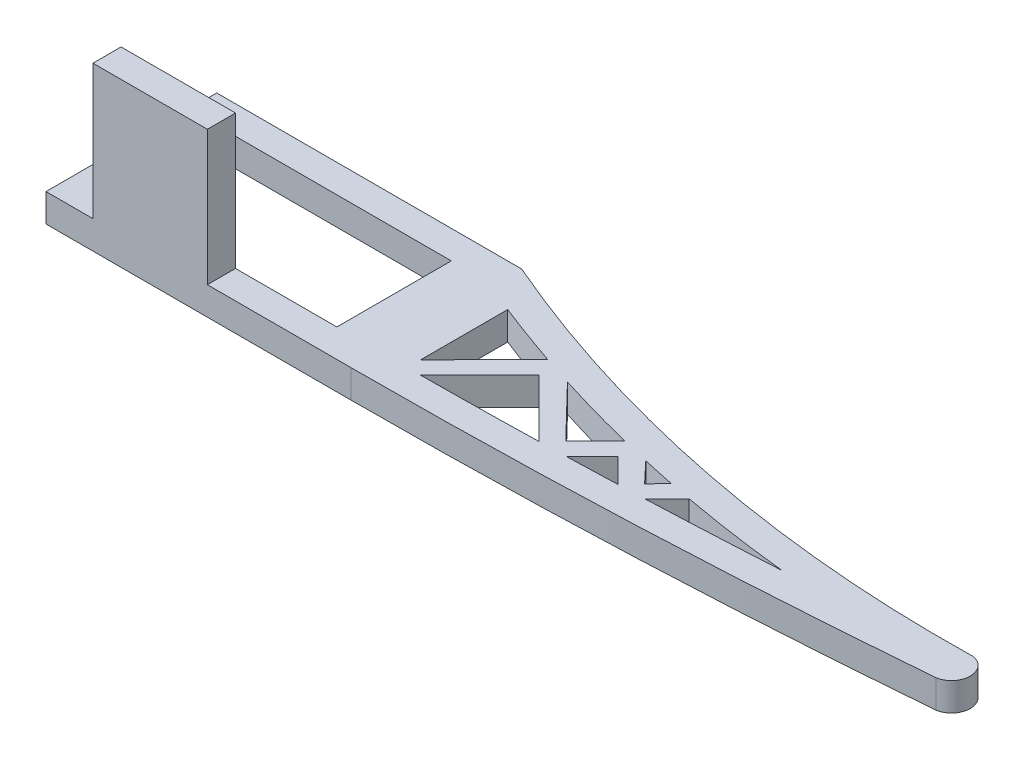
ISO-10303-21;
HEADER;
FILE_DESCRIPTION(('STEP AP214'),'2;1');
FILE_NAME('part.step','',(''),(''),'','','');
FILE_SCHEMA(('AUTOMOTIVE_DESIGN { 1 0 10303 214 1 1 1 1 }'));
ENDSEC;
DATA;
#1=APPLICATION_CONTEXT('core data for automotive mechanical design processes');
#2=APPLICATION_PROTOCOL_DEFINITION('international standard','automotive_design',2000,#1);
#3=PRODUCT_CONTEXT('',#1,'mechanical');
#4=PRODUCT('Part','Part','',(#3));
#5=PRODUCT_RELATED_PRODUCT_CATEGORY('part','',(#4));
#6=PRODUCT_DEFINITION_FORMATION('','',#4);
#7=PRODUCT_DEFINITION_CONTEXT('part definition',#1,'design');
#8=PRODUCT_DEFINITION('design','',#6,#7);
#9=PRODUCT_DEFINITION_SHAPE('','',#8);
#10=(LENGTH_UNIT() NAMED_UNIT(*) SI_UNIT(.MILLI.,.METRE.));
#11=(NAMED_UNIT(*) PLANE_ANGLE_UNIT() SI_UNIT($,.RADIAN.));
#12=(NAMED_UNIT(*) SI_UNIT($,.STERADIAN.) SOLID_ANGLE_UNIT());
#13=UNCERTAINTY_MEASURE_WITH_UNIT(LENGTH_MEASURE(1.E-05),#10,'distance_accuracy_value','');
#14=(GEOMETRIC_REPRESENTATION_CONTEXT(3) GLOBAL_UNCERTAINTY_ASSIGNED_CONTEXT((#13)) GLOBAL_UNIT_ASSIGNED_CONTEXT((#10,
#11,#12)) REPRESENTATION_CONTEXT('',''));
#15=CARTESIAN_POINT('',(0.,0.,0.));
#16=DIRECTION('',(0.,0.,1.));
#17=DIRECTION('',(1.,0.,0.));
#18=AXIS2_PLACEMENT_3D('',#15,#16,#17);
#19=CARTESIAN_POINT('',(16.25,3.,-692.267762496661));
#20=DIRECTION('',(0.,1.,0.));
#21=DIRECTION('',(0.,0.,1.));
#22=AXIS2_PLACEMENT_3D('',#19,#20,#21);
#23=PLANE('',#22);
#24=DIRECTION('',(0.,0.,1.));
#25=VECTOR('',#24,1.);
#26=CARTESIAN_POINT('',(-11.25,3.,5.99999999999999));
#27=LINE('',#26,#25);
#28=CARTESIAN_POINT('',(-11.25,3.,5.99999999999999));
#29=VERTEX_POINT('',#28);
#30=CARTESIAN_POINT('',(-11.25,3.,9.));
#31=VERTEX_POINT('',#30);
#32=EDGE_CURVE('E274',#29,#31,#27,.T.);
#33=ORIENTED_EDGE('',*,*,#32,.F.);
#34=DIRECTION('',(0.,0.,1.));
#35=VECTOR('',#34,1.);
#36=CARTESIAN_POINT('',(-11.25,3.,-6.2));
#37=LINE('',#36,#35);
#38=CARTESIAN_POINT('',(-11.25,3.,-6.2));
#39=VERTEX_POINT('',#38);
#40=EDGE_CURVE('E481',#39,#29,#37,.T.);
#41=ORIENTED_EDGE('',*,*,#40,.F.);
#42=DIRECTION('',(-1.,0.,0.));
#43=VECTOR('',#42,1.);
#44=CARTESIAN_POINT('',(-11.25,3.,-6.2));
#45=LINE('',#44,#43);
#46=CARTESIAN_POINT('',(11.75,3.,-6.19999999999998));
#47=VERTEX_POINT('',#46);
#48=EDGE_CURVE('E493',#47,#39,#45,.T.);
#49=ORIENTED_EDGE('',*,*,#48,.F.);
#50=DIRECTION('',(0.,0.,-1.));
#51=VECTOR('',#50,1.);
#52=CARTESIAN_POINT('',(11.75,3.,-6.2));
#53=LINE('',#52,#51);
#54=CARTESIAN_POINT('',(11.75,3.,5.99999999999999));
#55=VERTEX_POINT('',#54);
#56=EDGE_CURVE('E489',#55,#47,#53,.T.);
#57=ORIENTED_EDGE('',*,*,#56,.F.);
#58=DIRECTION('',(1.,0.,0.));
#59=VECTOR('',#58,1.);
#60=CARTESIAN_POINT('',(-11.25,3.,5.99999999999999));
#61=LINE('',#60,#59);
#62=CARTESIAN_POINT('',(0.950000000000001,3.,5.99999999999999));
#63=VERTEX_POINT('',#62);
#64=EDGE_CURVE('E485',#63,#55,#61,.T.);
#65=ORIENTED_EDGE('',*,*,#64,.F.);
#66=DIRECTION('',(0.,0.,-1.));
#67=VECTOR('',#66,1.);
#68=CARTESIAN_POINT('',(0.950000000000001,3.,5.99999999999999));
#69=LINE('',#68,#67);
#70=CARTESIAN_POINT('',(0.95,3.,9.));
#71=VERTEX_POINT('',#70);
#72=EDGE_CURVE('E61',#71,#63,#69,.T.);
#73=ORIENTED_EDGE('',*,*,#72,.F.);
#74=DIRECTION('',(1.,0.,0.));
#75=VECTOR('',#74,1.);
#76=CARTESIAN_POINT('',(-16.25,3.,9.));
#77=LINE('',#76,#75);
#78=CARTESIAN_POINT('',(16.25,3.,9.00000000000001));
#79=VERTEX_POINT('',#78);
#80=EDGE_CURVE('E528',#71,#79,#77,.T.);
#81=ORIENTED_EDGE('',*,*,#80,.T.);
#82=CARTESIAN_POINT('',(16.25,3.,-692.267762496661));
#83=DIRECTION('',(0.,1.,0.));
#84=DIRECTION('',(0.,0.,1.));
#85=AXIS2_PLACEMENT_3D('',#82,#83,#84);
#86=CIRCLE('',#85,701.267762496661);
#87=CARTESIAN_POINT('',(76.0730564628563,3.,6.44367767912089));
#88=VERTEX_POINT('',#87);
#89=EDGE_CURVE('E532',#79,#88,#86,.T.);
#90=ORIENTED_EDGE('',*,*,#89,.T.);
#91=CARTESIAN_POINT('',(75.7340992531813,3.,4.4726099456299));
#92=DIRECTION('',(0.,1.,0.));
#93=DIRECTION('',(0.,0.,1.));
#94=AXIS2_PLACEMENT_3D('',#91,#92,#93);
#95=CIRCLE('',#94,2.);
#96=CARTESIAN_POINT('',(76.0730564628563,3.,2.50154221213891));
#97=VERTEX_POINT('',#96);
#98=EDGE_CURVE('E535',#88,#97,#95,.T.);
#99=ORIENTED_EDGE('',*,*,#98,.T.);
#100=CARTESIAN_POINT('',(73.0415388145316,3.,-140.770806467443));
#101=DIRECTION('',(0.,-1.,0.));
#102=DIRECTION('',(0.,0.,1.));
#103=AXIS2_PLACEMENT_3D('',#100,#101,#102);
#104=CIRCLE('',#103,143.304417222274);
#105=CARTESIAN_POINT('',(16.25,3.,-9.2));
#106=VERTEX_POINT('',#105);
#107=EDGE_CURVE('E538',#97,#106,#104,.T.);
#108=ORIENTED_EDGE('',*,*,#107,.T.);
#109=DIRECTION('',(-1.,0.,0.));
#110=VECTOR('',#109,1.);
#111=CARTESIAN_POINT('',(-16.25,3.,-9.2));
#112=LINE('',#111,#110);
#113=CARTESIAN_POINT('',(-16.25,3.,-9.2));
#114=VERTEX_POINT('',#113);
#115=EDGE_CURVE('E541',#106,#114,#112,.T.);
#116=ORIENTED_EDGE('',*,*,#115,.T.);
#117=DIRECTION('',(0.,0.,1.));
#118=VECTOR('',#117,1.);
#119=CARTESIAN_POINT('',(-16.25,3.,-9.2));
#120=LINE('',#119,#118);
#121=CARTESIAN_POINT('',(-16.25,3.,9.));
#122=VERTEX_POINT('',#121);
#123=EDGE_CURVE('E525',#114,#122,#120,.T.);
#124=ORIENTED_EDGE('',*,*,#123,.T.);
#125=EDGE_CURVE('E68',#122,#31,#77,.T.);
#126=ORIENTED_EDGE('',*,*,#125,.T.);
#127=EDGE_LOOP('',(#33,#41,#49,#57,#65,#73,#81,#90,#99,#108,#116,#124,#126));
#128=FACE_BOUND('',#127,.T.);
#129=DIRECTION('',(-0.707106781186517,0.,-0.707106781186578));
#130=VECTOR('',#129,1.);
#131=CARTESIAN_POINT('',(38.6987546768364,3.,2.97606485174279));
#132=LINE('',#131,#130);
#133=CARTESIAN_POINT('',(41.2741448321575,3.,5.551455007064));
#134=VERTEX_POINT('',#133);
#135=CARTESIAN_POINT('',(38.6987546768364,3.,2.97606485174284));
#136=VERTEX_POINT('',#135);
#137=EDGE_CURVE('E368',#134,#136,#132,.T.);
#138=ORIENTED_EDGE('',*,*,#137,.F.);
#139=CARTESIAN_POINT('',(16.2499999999498,3.,-692.26776249783));
#140=DIRECTION('',(0.,1.,0.));
#141=DIRECTION('',(0.,0.,1.));
#142=AXIS2_PLACEMENT_3D('',#139,#140,#141);
#143=CIRCLE('',#142,698.26776249783);
#144=CARTESIAN_POINT('',(35.9528501243553,3.,5.72196940422404));
#145=VERTEX_POINT('',#144);
#146=EDGE_CURVE('E359',#145,#134,#143,.T.);
#147=ORIENTED_EDGE('',*,*,#146,.F.);
#148=DIRECTION('',(-0.707106781186534,0.,0.707106781186561));
#149=VECTOR('',#148,1.);
#150=CARTESIAN_POINT('',(35.9528501243553,3.,5.72196940422404));
#151=LINE('',#150,#149);
#152=EDGE_CURVE('E363',#136,#145,#151,.T.);
#153=ORIENTED_EDGE('',*,*,#152,.F.);
#154=EDGE_LOOP('',(#138,#147,#153));
#155=FACE_BOUND('',#154,.T.);
#156=DIRECTION('',(0.697490554621267,0.,-0.716593975842749));
#157=VECTOR('',#156,1.);
#158=CARTESIAN_POINT('',(34.4991155487943,3.,4.34727685503876));
#159=LINE('',#158,#157);
#160=CARTESIAN_POINT('',(34.4991155487943,3.,4.34727685503876));
#161=VERTEX_POINT('',#160);
#162=CARTESIAN_POINT('',(37.5886614898829,3.,1.17311199387346));
#163=VERTEX_POINT('',#162);
#164=EDGE_CURVE('E335',#161,#163,#159,.T.);
#165=ORIENTED_EDGE('',*,*,#164,.F.);
#166=DIRECTION('',(0.695538394909189,0.,0.718488929077651));
#167=VECTOR('',#166,1.);
#168=CARTESIAN_POINT('',(29.1123972203652,3.,-1.21718588542754));
#169=LINE('',#168,#167);
#170=CARTESIAN_POINT('',(29.1123972203652,3.,-1.21718588542754));
#171=VERTEX_POINT('',#170);
#172=EDGE_CURVE('E326',#171,#161,#169,.T.);
#173=ORIENTED_EDGE('',*,*,#172,.F.);
#174=CARTESIAN_POINT('',(73.0415388145315,3.,-140.770806467442));
#175=DIRECTION('',(0.,-1.,0.));
#176=DIRECTION('',(0.,0.,1.));
#177=AXIS2_PLACEMENT_3D('',#174,#175,#176);
#178=CIRCLE('',#177,146.304417222274);
#179=EDGE_CURVE('E330',#163,#171,#178,.T.);
#180=ORIENTED_EDGE('',*,*,#179,.F.);
#181=EDGE_LOOP('',(#165,#173,#180));
#182=FACE_BOUND('',#181,.T.);
#183=DIRECTION('',(-0.70710678118655,0.,-0.707106781186545));
#184=VECTOR('',#183,1.);
#185=CARTESIAN_POINT('',(26.9905902912229,3.,-0.33282127778641));
#186=LINE('',#185,#184);
#187=CARTESIAN_POINT('',(33.1196036039778,3.,5.79619203496862));
#188=VERTEX_POINT('',#187);
#189=CARTESIAN_POINT('',(26.9905902912229,3.,-0.332821277786388));
#190=VERTEX_POINT('',#189);
#191=EDGE_CURVE('E393',#188,#190,#186,.T.);
#192=ORIENTED_EDGE('',*,*,#191,.F.);
#193=CARTESIAN_POINT('',(16.2499999999498,3.,-692.26776249783));
#194=DIRECTION('',(0.,1.,0.));
#195=DIRECTION('',(0.,0.,1.));
#196=AXIS2_PLACEMENT_3D('',#193,#194,#195);
#197=CIRCLE('',#196,698.26776249783);
#198=CARTESIAN_POINT('',(20.671769546605,3.,5.98599946683159));
#199=VERTEX_POINT('',#198);
#200=EDGE_CURVE('E427',#199,#188,#197,.T.);
#201=ORIENTED_EDGE('',*,*,#200,.F.);
#202=DIRECTION('',(-0.707106781186539,0.,0.707106781186556));
#203=VECTOR('',#202,1.);
#204=CARTESIAN_POINT('',(20.671769546605,3.,5.98599946683159));
#205=LINE('',#204,#203);
#206=EDGE_CURVE('E431',#190,#199,#205,.T.);
#207=ORIENTED_EDGE('',*,*,#206,.F.);
#208=EDGE_LOOP('',(#192,#201,#207));
#209=FACE_BOUND('',#208,.T.);
#210=CARTESIAN_POINT('',(73.0415388145315,3.,-140.770806467442));
#211=DIRECTION('',(0.,-1.,0.));
#212=DIRECTION('',(0.,0.,1.));
#213=AXIS2_PLACEMENT_3D('',#210,#211,#212);
#214=CIRCLE('',#213,146.304417222274);
#215=CARTESIAN_POINT('',(57.9534950298761,3.,4.75353319263505));
#216=VERTEX_POINT('',#215);
#217=CARTESIAN_POINT('',(46.3950479740728,3.,3.08657785688987));
#218=VERTEX_POINT('',#217);
#219=EDGE_CURVE('E403',#216,#218,#214,.T.);
#220=ORIENTED_EDGE('',*,*,#219,.F.);
#221=CARTESIAN_POINT('',(16.2499999999498,3.,-692.26776249783));
#222=DIRECTION('',(0.,1.,0.));
#223=DIRECTION('',(0.,0.,1.));
#224=AXIS2_PLACEMENT_3D('',#221,#222,#223);
#225=CIRCLE('',#224,698.26776249783);
#226=CARTESIAN_POINT('',(44.1095240356003,3.,5.44400826731395));
#227=VERTEX_POINT('',#226);
#228=EDGE_CURVE('E394',#227,#216,#225,.T.);
#229=ORIENTED_EDGE('',*,*,#228,.F.);
#230=DIRECTION('',(-0.696072187513183,0.,0.717971802907755));
#231=VECTOR('',#230,1.);
#232=CARTESIAN_POINT('',(44.1095240356003,3.,5.444008267314));
#233=LINE('',#232,#231);
#234=EDGE_CURVE('E398',#218,#227,#233,.T.);
#235=ORIENTED_EDGE('',*,*,#234,.F.);
#236=EDGE_LOOP('',(#220,#229,#235));
#237=FACE_BOUND('',#236,.T.);
#238=DIRECTION('',(0.688032215754689,0.,-0.725680143095905));
#239=VECTOR('',#238,1.);
#240=CARTESIAN_POINT('',(42.638111064004,3.,4.08699411416416));
#241=LINE('',#240,#239);
#242=CARTESIAN_POINT('',(42.638111064004,3.,4.08699411416416));
#243=VERTEX_POINT('',#242);
#244=CARTESIAN_POINT('',(44.0225307638828,3.,2.62682137383555));
#245=VERTEX_POINT('',#244);
#246=EDGE_CURVE('E302',#243,#245,#241,.T.);
#247=ORIENTED_EDGE('',*,*,#246,.F.);
#248=DIRECTION('',(0.6855739045721,0.,0.728003036648725));
#249=VECTOR('',#248,1.);
#250=CARTESIAN_POINT('',(40.5625292952941,3.,1.88295772894521));
#251=LINE('',#250,#249);
#252=CARTESIAN_POINT('',(40.5625292952941,3.,1.88295772894521));
#253=VERTEX_POINT('',#252);
#254=EDGE_CURVE('E293',#253,#243,#251,.T.);
#255=ORIENTED_EDGE('',*,*,#254,.F.);
#256=CARTESIAN_POINT('',(73.0415388145315,3.,-140.770806467442));
#257=DIRECTION('',(0.,-1.,0.));
#258=DIRECTION('',(0.,0.,1.));
#259=AXIS2_PLACEMENT_3D('',#256,#257,#258);
#260=CIRCLE('',#259,146.304417222274);
#261=EDGE_CURVE('E297',#245,#253,#260,.T.);
#262=ORIENTED_EDGE('',*,*,#261,.F.);
#263=EDGE_LOOP('',(#247,#255,#262));
#264=FACE_BOUND('',#263,.T.);
#265=CARTESIAN_POINT('',(73.0415388145315,3.,-140.770806467442));
#266=DIRECTION('',(0.,-1.,0.));
#267=DIRECTION('',(0.,0.,1.));
#268=AXIS2_PLACEMENT_3D('',#265,#266,#267);
#269=CIRCLE('',#268,146.304417222274);
#270=CARTESIAN_POINT('',(25.977749380802,3.,-2.24289511782721));
#271=VERTEX_POINT('',#270);
#272=CARTESIAN_POINT('',(19.25,3.,-4.71400637750197));
#273=VERTEX_POINT('',#272);
#274=EDGE_CURVE('E406',#271,#273,#269,.T.);
#275=ORIENTED_EDGE('',*,*,#274,.F.);
#276=DIRECTION('',(0.70215886774458,0.,-0.712020311822387));
#277=VECTOR('',#276,1.);
#278=CARTESIAN_POINT('',(19.25,3.,4.57934188869029));
#279=LINE('',#278,#277);
#280=CARTESIAN_POINT('',(19.25,3.,4.57934188869029));
#281=VERTEX_POINT('',#280);
#282=EDGE_CURVE('E453',#281,#271,#279,.T.);
#283=ORIENTED_EDGE('',*,*,#282,.F.);
#284=DIRECTION('',(0.,0.,1.));
#285=VECTOR('',#284,1.);
#286=CARTESIAN_POINT('',(19.25,3.,-4.71400637750197));
#287=LINE('',#286,#285);
#288=EDGE_CURVE('E464',#273,#281,#287,.T.);
#289=ORIENTED_EDGE('',*,*,#288,.F.);
#290=EDGE_LOOP('',(#275,#283,#289));
#291=FACE_BOUND('',#290,.T.);
#292=ADVANCED_FACE('F45',(#128,#155,#182,#209,#237,#264,#291),#23,.T.);
#293=CARTESIAN_POINT('',(16.25,0.,-692.267762496661));
#294=DIRECTION('',(0.,1.,0.));
#295=DIRECTION('',(0.,0.,1.));
#296=AXIS2_PLACEMENT_3D('',#293,#294,#295);
#297=PLANE('',#296);
#298=CARTESIAN_POINT('',(16.2499999999498,0.,-692.26776249783));
#299=DIRECTION('',(0.,1.,0.));
#300=DIRECTION('',(0.,0.,1.));
#301=AXIS2_PLACEMENT_3D('',#298,#299,#300);
#302=CIRCLE('',#301,698.26776249783);
#303=CARTESIAN_POINT('',(35.9528501243553,0.,5.72196940422398));
#304=VERTEX_POINT('',#303);
#305=CARTESIAN_POINT('',(41.2741448321575,0.,5.551455007064));
#306=VERTEX_POINT('',#305);
#307=EDGE_CURVE('E353',#304,#306,#302,.T.);
#308=ORIENTED_EDGE('',*,*,#307,.T.);
#309=DIRECTION('',(-0.707106781186517,0.,-0.707106781186578));
#310=VECTOR('',#309,1.);
#311=CARTESIAN_POINT('',(38.6987546768364,0.,2.97606485174279));
#312=LINE('',#311,#310);
#313=CARTESIAN_POINT('',(38.6987546768364,0.,2.97606485174279));
#314=VERTEX_POINT('',#313);
#315=EDGE_CURVE('E364',#306,#314,#312,.T.);
#316=ORIENTED_EDGE('',*,*,#315,.T.);
#317=DIRECTION('',(-0.707106781186534,0.,0.707106781186561));
#318=VECTOR('',#317,1.);
#319=CARTESIAN_POINT('',(35.9528501243553,0.,5.72196940422404));
#320=LINE('',#319,#318);
#321=EDGE_CURVE('E375',#314,#304,#320,.T.);
#322=ORIENTED_EDGE('',*,*,#321,.T.);
#323=EDGE_LOOP('',(#308,#316,#322));
#324=FACE_BOUND('',#323,.T.);
#325=DIRECTION('',(0.695538394909189,0.,0.718488929077651));
#326=VECTOR('',#325,1.);
#327=CARTESIAN_POINT('',(29.1123972203652,0.,-1.21718588542754));
#328=LINE('',#327,#326);
#329=CARTESIAN_POINT('',(29.1123972203652,0.,-1.21718588542755));
#330=VERTEX_POINT('',#329);
#331=CARTESIAN_POINT('',(34.4991155487943,0.,4.34727685503876));
#332=VERTEX_POINT('',#331);
#333=EDGE_CURVE('E320',#330,#332,#328,.T.);
#334=ORIENTED_EDGE('',*,*,#333,.T.);
#335=DIRECTION('',(0.697490554621267,0.,-0.716593975842749));
#336=VECTOR('',#335,1.);
#337=CARTESIAN_POINT('',(34.4991155487943,0.,4.34727685503876));
#338=LINE('',#337,#336);
#339=CARTESIAN_POINT('',(37.5886614898829,0.,1.17311199387346));
#340=VERTEX_POINT('',#339);
#341=EDGE_CURVE('E331',#332,#340,#338,.T.);
#342=ORIENTED_EDGE('',*,*,#341,.T.);
#343=CARTESIAN_POINT('',(73.0415388145315,0.,-140.770806467442));
#344=DIRECTION('',(0.,-1.,0.));
#345=DIRECTION('',(0.,0.,1.));
#346=AXIS2_PLACEMENT_3D('',#343,#344,#345);
#347=CIRCLE('',#346,146.304417222274);
#348=EDGE_CURVE('E342',#340,#330,#347,.T.);
#349=ORIENTED_EDGE('',*,*,#348,.T.);
#350=EDGE_LOOP('',(#334,#342,#349));
#351=FACE_BOUND('',#350,.T.);
#352=CARTESIAN_POINT('',(16.2499999999498,0.,-692.26776249783));
#353=DIRECTION('',(0.,1.,0.));
#354=DIRECTION('',(0.,0.,1.));
#355=AXIS2_PLACEMENT_3D('',#352,#353,#354);
#356=CIRCLE('',#355,698.26776249783);
#357=CARTESIAN_POINT('',(20.6717695466051,0.,5.98599946683154));
#358=VERTEX_POINT('',#357);
#359=CARTESIAN_POINT('',(33.1196036039778,0.,5.79619203496862));
#360=VERTEX_POINT('',#359);
#361=EDGE_CURVE('E421',#358,#360,#356,.T.);
#362=ORIENTED_EDGE('',*,*,#361,.T.);
#363=DIRECTION('',(-0.70710678118655,0.,-0.707106781186545));
#364=VECTOR('',#363,1.);
#365=CARTESIAN_POINT('',(26.9905902912229,0.,-0.33282127778641));
#366=LINE('',#365,#364);
#367=CARTESIAN_POINT('',(26.9905902912229,0.,-0.33282127778641));
#368=VERTEX_POINT('',#367);
#369=EDGE_CURVE('E432',#360,#368,#366,.T.);
#370=ORIENTED_EDGE('',*,*,#369,.T.);
#371=DIRECTION('',(-0.707106781186539,0.,0.707106781186556));
#372=VECTOR('',#371,1.);
#373=CARTESIAN_POINT('',(20.671769546605,0.,5.98599946683159));
#374=LINE('',#373,#372);
#375=EDGE_CURVE('E441',#368,#358,#374,.T.);
#376=ORIENTED_EDGE('',*,*,#375,.T.);
#377=EDGE_LOOP('',(#362,#370,#376));
#378=FACE_BOUND('',#377,.T.);
#379=CARTESIAN_POINT('',(16.2499999999498,0.,-692.26776249783));
#380=DIRECTION('',(0.,1.,0.));
#381=DIRECTION('',(0.,0.,1.));
#382=AXIS2_PLACEMENT_3D('',#379,#380,#381);
#383=CIRCLE('',#382,698.26776249783);
#384=CARTESIAN_POINT('',(44.1095240356003,0.,5.44400826731389));
#385=VERTEX_POINT('',#384);
#386=CARTESIAN_POINT('',(57.9534950298761,0.,4.75353319263505));
#387=VERTEX_POINT('',#386);
#388=EDGE_CURVE('E386',#385,#387,#383,.T.);
#389=ORIENTED_EDGE('',*,*,#388,.T.);
#390=CARTESIAN_POINT('',(73.0415388145315,0.,-140.770806467442));
#391=DIRECTION('',(0.,-1.,0.));
#392=DIRECTION('',(0.,0.,1.));
#393=AXIS2_PLACEMENT_3D('',#390,#391,#392);
#394=CIRCLE('',#393,146.304417222274);
#395=CARTESIAN_POINT('',(46.3950479740729,0.,3.08657785688982));
#396=VERTEX_POINT('',#395);
#397=EDGE_CURVE('E399',#387,#396,#394,.T.);
#398=ORIENTED_EDGE('',*,*,#397,.T.);
#399=DIRECTION('',(-0.696072187513183,0.,0.717971802907755));
#400=VECTOR('',#399,1.);
#401=CARTESIAN_POINT('',(44.1095240356003,0.,5.444008267314));
#402=LINE('',#401,#400);
#403=EDGE_CURVE('E410',#396,#385,#402,.T.);
#404=ORIENTED_EDGE('',*,*,#403,.T.);
#405=EDGE_LOOP('',(#389,#398,#404));
#406=FACE_BOUND('',#405,.T.);
#407=DIRECTION('',(0.6855739045721,0.,0.728003036648725));
#408=VECTOR('',#407,1.);
#409=CARTESIAN_POINT('',(40.5625292952941,0.,1.88295772894521));
#410=LINE('',#409,#408);
#411=CARTESIAN_POINT('',(40.5625292952941,0.,1.8829577289452));
#412=VERTEX_POINT('',#411);
#413=CARTESIAN_POINT('',(42.638111064004,0.,4.08699411416416));
#414=VERTEX_POINT('',#413);
#415=EDGE_CURVE('E290',#412,#414,#410,.T.);
#416=ORIENTED_EDGE('',*,*,#415,.T.);
#417=DIRECTION('',(0.688032215754689,0.,-0.725680143095905));
#418=VECTOR('',#417,1.);
#419=CARTESIAN_POINT('',(42.638111064004,0.,4.08699411416416));
#420=LINE('',#419,#418);
#421=CARTESIAN_POINT('',(44.0225307638828,0.,2.62682137383555));
#422=VERTEX_POINT('',#421);
#423=EDGE_CURVE('E298',#414,#422,#420,.T.);
#424=ORIENTED_EDGE('',*,*,#423,.T.);
#425=CARTESIAN_POINT('',(73.0415388145315,0.,-140.770806467442));
#426=DIRECTION('',(0.,-1.,0.));
#427=DIRECTION('',(0.,0.,1.));
#428=AXIS2_PLACEMENT_3D('',#425,#426,#427);
#429=CIRCLE('',#428,146.304417222274);
#430=EDGE_CURVE('E309',#422,#412,#429,.T.);
#431=ORIENTED_EDGE('',*,*,#430,.T.);
#432=EDGE_LOOP('',(#416,#424,#431));
#433=FACE_BOUND('',#432,.T.);
#434=DIRECTION('',(0.70215886774458,0.,-0.712020311822387));
#435=VECTOR('',#434,1.);
#436=CARTESIAN_POINT('',(19.25,0.,4.57934188869029));
#437=LINE('',#436,#435);
#438=CARTESIAN_POINT('',(19.25,0.,4.57934188869025));
#439=VERTEX_POINT('',#438);
#440=CARTESIAN_POINT('',(25.977749380802,0.,-2.24289511782721));
#441=VERTEX_POINT('',#440);
#442=EDGE_CURVE('E457',#439,#441,#437,.T.);
#443=ORIENTED_EDGE('',*,*,#442,.T.);
#444=CARTESIAN_POINT('',(73.0415388145315,0.,-140.770806467442));
#445=DIRECTION('',(0.,-1.,0.));
#446=DIRECTION('',(0.,0.,1.));
#447=AXIS2_PLACEMENT_3D('',#444,#445,#446);
#448=CIRCLE('',#447,146.304417222274);
#449=CARTESIAN_POINT('',(19.25,0.,-4.71400637750197));
#450=VERTEX_POINT('',#449);
#451=EDGE_CURVE('E448',#441,#450,#448,.T.);
#452=ORIENTED_EDGE('',*,*,#451,.T.);
#453=DIRECTION('',(0.,0.,1.));
#454=VECTOR('',#453,1.);
#455=CARTESIAN_POINT('',(19.25,0.,-4.71400637750197));
#456=LINE('',#455,#454);
#457=EDGE_CURVE('E452',#450,#439,#456,.T.);
#458=ORIENTED_EDGE('',*,*,#457,.T.);
#459=EDGE_LOOP('',(#443,#452,#458));
#460=FACE_BOUND('',#459,.T.);
#461=DIRECTION('',(0.,0.,1.));
#462=VECTOR('',#461,1.);
#463=CARTESIAN_POINT('',(-16.25,0.,-9.2));
#464=LINE('',#463,#462);
#465=CARTESIAN_POINT('',(-16.25,0.,-9.2));
#466=VERTEX_POINT('',#465);
#467=CARTESIAN_POINT('',(-16.25,0.,9.));
#468=VERTEX_POINT('',#467);
#469=EDGE_CURVE('E524',#466,#468,#464,.T.);
#470=ORIENTED_EDGE('',*,*,#469,.F.);
#471=DIRECTION('',(-1.,0.,0.));
#472=VECTOR('',#471,1.);
#473=CARTESIAN_POINT('',(-16.25,0.,-9.2));
#474=LINE('',#473,#472);
#475=CARTESIAN_POINT('',(16.25,0.,-9.2));
#476=VERTEX_POINT('',#475);
#477=EDGE_CURVE('E529',#476,#466,#474,.T.);
#478=ORIENTED_EDGE('',*,*,#477,.F.);
#479=CARTESIAN_POINT('',(73.0415388145316,0.,-140.770806467443));
#480=DIRECTION('',(0.,-1.,0.));
#481=DIRECTION('',(0.,0.,1.));
#482=AXIS2_PLACEMENT_3D('',#479,#480,#481);
#483=CIRCLE('',#482,143.304417222274);
#484=CARTESIAN_POINT('',(76.0730564628563,0.,2.50154221213891));
#485=VERTEX_POINT('',#484);
#486=EDGE_CURVE('E557',#485,#476,#483,.T.);
#487=ORIENTED_EDGE('',*,*,#486,.F.);
#488=CARTESIAN_POINT('',(75.7340992531813,0.,4.4726099456299));
#489=DIRECTION('',(0.,1.,0.));
#490=DIRECTION('',(0.,0.,1.));
#491=AXIS2_PLACEMENT_3D('',#488,#489,#490);
#492=CIRCLE('',#491,2.);
#493=CARTESIAN_POINT('',(76.0730564628563,0.,6.44367767912089));
#494=VERTEX_POINT('',#493);
#495=EDGE_CURVE('E554',#494,#485,#492,.T.);
#496=ORIENTED_EDGE('',*,*,#495,.F.);
#497=CARTESIAN_POINT('',(16.25,0.,-692.267762496661));
#498=DIRECTION('',(0.,1.,0.));
#499=DIRECTION('',(0.,0.,1.));
#500=AXIS2_PLACEMENT_3D('',#497,#498,#499);
#501=CIRCLE('',#500,701.267762496661);
#502=CARTESIAN_POINT('',(16.25,0.,9.00000000000001));
#503=VERTEX_POINT('',#502);
#504=EDGE_CURVE('E551',#503,#494,#501,.T.);
#505=ORIENTED_EDGE('',*,*,#504,.F.);
#506=DIRECTION('',(1.,0.,0.));
#507=VECTOR('',#506,1.);
#508=CARTESIAN_POINT('',(-16.25,0.,9.));
#509=LINE('',#508,#507);
#510=EDGE_CURVE('E548',#468,#503,#509,.T.);
#511=ORIENTED_EDGE('',*,*,#510,.F.);
#512=EDGE_LOOP('',(#470,#478,#487,#496,#505,#511));
#513=FACE_BOUND('',#512,.T.);
#514=DIRECTION('',(0.,0.,1.));
#515=VECTOR('',#514,1.);
#516=CARTESIAN_POINT('',(-11.25,0.,-6.2));
#517=LINE('',#516,#515);
#518=CARTESIAN_POINT('',(-11.25,0.,-6.19999999999998));
#519=VERTEX_POINT('',#518);
#520=CARTESIAN_POINT('',(-11.25,0.,5.99999999999999));
#521=VERTEX_POINT('',#520);
#522=EDGE_CURVE('E474',#519,#521,#517,.T.);
#523=ORIENTED_EDGE('',*,*,#522,.T.);
#524=DIRECTION('',(1.,0.,0.));
#525=VECTOR('',#524,1.);
#526=CARTESIAN_POINT('',(-11.25,0.,5.99999999999999));
#527=LINE('',#526,#525);
#528=CARTESIAN_POINT('',(11.75,0.,5.99999999999999));
#529=VERTEX_POINT('',#528);
#530=EDGE_CURVE('E500',#521,#529,#527,.T.);
#531=ORIENTED_EDGE('',*,*,#530,.T.);
#532=DIRECTION('',(0.,0.,-1.));
#533=VECTOR('',#532,1.);
#534=CARTESIAN_POINT('',(11.75,0.,-6.2));
#535=LINE('',#534,#533);
#536=CARTESIAN_POINT('',(11.75,0.,-6.2));
#537=VERTEX_POINT('',#536);
#538=EDGE_CURVE('E504',#529,#537,#535,.T.);
#539=ORIENTED_EDGE('',*,*,#538,.T.);
#540=DIRECTION('',(-1.,0.,0.));
#541=VECTOR('',#540,1.);
#542=CARTESIAN_POINT('',(-11.25,0.,-6.2));
#543=LINE('',#542,#541);
#544=EDGE_CURVE('E486',#537,#519,#543,.T.);
#545=ORIENTED_EDGE('',*,*,#544,.T.);
#546=EDGE_LOOP('',(#523,#531,#539,#545));
#547=FACE_BOUND('',#546,.T.);
#548=ADVANCED_FACE('F587',(#324,#351,#378,#406,#433,#460,#513,#547),#297,.F.);
#549=CARTESIAN_POINT('',(-16.25,3.,-9.2));
#550=DIRECTION('',(1.,0.,0.));
#551=DIRECTION('',(0.,0.,-1.));
#552=AXIS2_PLACEMENT_3D('',#549,#550,#551);
#553=PLANE('',#552);
#554=ORIENTED_EDGE('',*,*,#469,.T.);
#555=DIRECTION('',(0.,-1.,0.));
#556=VECTOR('',#555,1.);
#557=CARTESIAN_POINT('',(-16.25,3.,9.));
#558=LINE('',#557,#556);
#559=EDGE_CURVE('E11',#122,#468,#558,.T.);
#560=ORIENTED_EDGE('',*,*,#559,.F.);
#561=ORIENTED_EDGE('',*,*,#123,.F.);
#562=DIRECTION('',(0.,-1.,0.));
#563=VECTOR('',#562,1.);
#564=CARTESIAN_POINT('',(-16.25,3.,-9.2));
#565=LINE('',#564,#563);
#566=EDGE_CURVE('E544',#114,#466,#565,.T.);
#567=ORIENTED_EDGE('',*,*,#566,.T.);
#568=EDGE_LOOP('',(#554,#560,#561,#567));
#569=FACE_BOUND('',#568,.T.);
#570=ADVANCED_FACE('F47',(#569),#553,.F.);
#571=CARTESIAN_POINT('',(-16.25,3.,9.));
#572=DIRECTION('',(0.,0.,-1.));
#573=DIRECTION('',(-1.,0.,0.));
#574=AXIS2_PLACEMENT_3D('',#571,#572,#573);
#575=PLANE('',#574);
#576=ORIENTED_EDGE('',*,*,#510,.T.);
#577=DIRECTION('',(0.,-1.,0.));
#578=VECTOR('',#577,1.);
#579=CARTESIAN_POINT('',(16.25,3.,9.00000000000001));
#580=LINE('',#579,#578);
#581=EDGE_CURVE('E54',#79,#503,#580,.T.);
#582=ORIENTED_EDGE('',*,*,#581,.F.);
#583=ORIENTED_EDGE('',*,*,#80,.F.);
#584=DIRECTION('',(0.,-1.,0.));
#585=VECTOR('',#584,1.);
#586=CARTESIAN_POINT('',(0.950000000000001,17.35,9.));
#587=LINE('',#586,#585);
#588=CARTESIAN_POINT('',(0.950000000000001,17.35,9.));
#589=VERTEX_POINT('',#588);
#590=EDGE_CURVE('E257',#589,#71,#587,.T.);
#591=ORIENTED_EDGE('',*,*,#590,.F.);
#592=DIRECTION('',(1.,0.,0.));
#593=VECTOR('',#592,1.);
#594=CARTESIAN_POINT('',(-11.25,17.35,9.00000000000001));
#595=LINE('',#594,#593);
#596=CARTESIAN_POINT('',(-11.25,17.35,9.00000000000001));
#597=VERTEX_POINT('',#596);
#598=EDGE_CURVE('E250',#597,#589,#595,.T.);
#599=ORIENTED_EDGE('',*,*,#598,.F.);
#600=DIRECTION('',(0.,-1.,0.));
#601=VECTOR('',#600,1.);
#602=CARTESIAN_POINT('',(-11.25,17.35,9.00000000000001));
#603=LINE('',#602,#601);
#604=EDGE_CURVE('E254',#597,#31,#603,.T.);
#605=ORIENTED_EDGE('',*,*,#604,.T.);
#606=ORIENTED_EDGE('',*,*,#125,.F.);
#607=ORIENTED_EDGE('',*,*,#559,.T.);
#608=EDGE_LOOP('',(#576,#582,#583,#591,#599,#605,#606,#607));
#609=FACE_BOUND('',#608,.T.);
#610=ADVANCED_FACE('F252',(#609),#575,.F.);
#611=CARTESIAN_POINT('',(16.25,3.,-692.267762496661));
#612=DIRECTION('',(0.,-1.,0.));
#613=DIRECTION('',(0.,0.,-1.));
#614=AXIS2_PLACEMENT_3D('',#611,#612,#613);
#615=CYLINDRICAL_SURFACE('',#614,701.267762496661);
#616=ORIENTED_EDGE('',*,*,#504,.T.);
#617=DIRECTION('',(0.,-1.,0.));
#618=VECTOR('',#617,1.);
#619=CARTESIAN_POINT('',(76.0730564628563,3.,6.44367767912089));
#620=LINE('',#619,#618);
#621=EDGE_CURVE('E573',#88,#494,#620,.T.);
#622=ORIENTED_EDGE('',*,*,#621,.F.);
#623=ORIENTED_EDGE('',*,*,#89,.F.);
#624=ORIENTED_EDGE('',*,*,#581,.T.);
#625=EDGE_LOOP('',(#616,#622,#623,#624));
#626=FACE_BOUND('',#625,.T.);
#627=ADVANCED_FACE('F582',(#626),#615,.T.);
#628=CARTESIAN_POINT('',(75.7340992531813,3.,4.4726099456299));
#629=DIRECTION('',(0.,-1.,0.));
#630=DIRECTION('',(0.,0.,-1.));
#631=AXIS2_PLACEMENT_3D('',#628,#629,#630);
#632=CYLINDRICAL_SURFACE('',#631,2.);
#633=ORIENTED_EDGE('',*,*,#495,.T.);
#634=DIRECTION('',(0.,-1.,0.));
#635=VECTOR('',#634,1.);
#636=CARTESIAN_POINT('',(76.0730564628563,3.,2.50154221213891));
#637=LINE('',#636,#635);
#638=EDGE_CURVE('E569',#97,#485,#637,.T.);
#639=ORIENTED_EDGE('',*,*,#638,.F.);
#640=ORIENTED_EDGE('',*,*,#98,.F.);
#641=ORIENTED_EDGE('',*,*,#621,.T.);
#642=EDGE_LOOP('',(#633,#639,#640,#641));
#643=FACE_BOUND('',#642,.T.);
#644=ADVANCED_FACE('F593',(#643),#632,.T.);
#645=CARTESIAN_POINT('',(73.0415388145316,3.,-140.770806467443));
#646=DIRECTION('',(0.,-1.,0.));
#647=DIRECTION('',(0.,0.,-1.));
#648=AXIS2_PLACEMENT_3D('',#645,#646,#647);
#649=CYLINDRICAL_SURFACE('',#648,143.304417222274);
#650=ORIENTED_EDGE('',*,*,#486,.T.);
#651=DIRECTION('',(0.,-1.,0.));
#652=VECTOR('',#651,1.);
#653=CARTESIAN_POINT('',(16.25,3.,-9.2));
#654=LINE('',#653,#652);
#655=EDGE_CURVE('E565',#106,#476,#654,.T.);
#656=ORIENTED_EDGE('',*,*,#655,.F.);
#657=ORIENTED_EDGE('',*,*,#107,.F.);
#658=ORIENTED_EDGE('',*,*,#638,.T.);
#659=EDGE_LOOP('',(#650,#656,#657,#658));
#660=FACE_BOUND('',#659,.T.);
#661=ADVANCED_FACE('F597',(#660),#649,.F.);
#662=CARTESIAN_POINT('',(-16.25,3.,-9.2));
#663=DIRECTION('',(0.,0.,1.));
#664=DIRECTION('',(1.,0.,0.));
#665=AXIS2_PLACEMENT_3D('',#662,#663,#664);
#666=PLANE('',#665);
#667=ORIENTED_EDGE('',*,*,#477,.T.);
#668=ORIENTED_EDGE('',*,*,#566,.F.);
#669=ORIENTED_EDGE('',*,*,#115,.F.);
#670=ORIENTED_EDGE('',*,*,#655,.T.);
#671=EDGE_LOOP('',(#667,#668,#669,#670));
#672=FACE_BOUND('',#671,.T.);
#673=ADVANCED_FACE('F656',(#672),#666,.F.);
#674=CARTESIAN_POINT('',(-11.25,3.,-6.2));
#675=DIRECTION('',(1.,0.,0.));
#676=DIRECTION('',(0.,0.,-1.));
#677=AXIS2_PLACEMENT_3D('',#674,#675,#676);
#678=PLANE('',#677);
#679=ORIENTED_EDGE('',*,*,#522,.F.);
#680=DIRECTION('',(0.,-1.,0.));
#681=VECTOR('',#680,1.);
#682=CARTESIAN_POINT('',(-11.25,3.,-6.2));
#683=LINE('',#682,#681);
#684=EDGE_CURVE('E496',#39,#519,#683,.T.);
#685=ORIENTED_EDGE('',*,*,#684,.F.);
#686=ORIENTED_EDGE('',*,*,#40,.T.);
#687=DIRECTION('',(0.,-1.,0.));
#688=VECTOR('',#687,1.);
#689=CARTESIAN_POINT('',(-11.25,3.,5.99999999999999));
#690=LINE('',#689,#688);
#691=EDGE_CURVE('E520',#29,#521,#690,.T.);
#692=ORIENTED_EDGE('',*,*,#691,.T.);
#693=EDGE_LOOP('',(#679,#685,#686,#692));
#694=FACE_BOUND('',#693,.T.);
#695=ADVANCED_FACE('F624',(#694),#678,.T.);
#696=CARTESIAN_POINT('',(-11.25,3.,5.99999999999999));
#697=DIRECTION('',(0.,0.,-1.));
#698=DIRECTION('',(-1.,0.,0.));
#699=AXIS2_PLACEMENT_3D('',#696,#697,#698);
#700=PLANE('',#699);
#701=ORIENTED_EDGE('',*,*,#530,.F.);
#702=ORIENTED_EDGE('',*,*,#691,.F.);
#703=DIRECTION('',(0.,-1.,0.));
#704=VECTOR('',#703,1.);
#705=CARTESIAN_POINT('',(-11.25,17.35,5.99999999999999));
#706=LINE('',#705,#704);
#707=CARTESIAN_POINT('',(-11.25,17.35,5.99999999999999));
#708=VERTEX_POINT('',#707);
#709=EDGE_CURVE('E610',#708,#29,#706,.T.);
#710=ORIENTED_EDGE('',*,*,#709,.F.);
#711=DIRECTION('',(-1.,0.,0.));
#712=VECTOR('',#711,1.);
#713=CARTESIAN_POINT('',(-11.25,17.35,5.99999999999999));
#714=LINE('',#713,#712);
#715=CARTESIAN_POINT('',(0.950000000000001,17.35,5.99999999999999));
#716=VERTEX_POINT('',#715);
#717=EDGE_CURVE('E267',#716,#708,#714,.T.);
#718=ORIENTED_EDGE('',*,*,#717,.F.);
#719=DIRECTION('',(0.,-1.,0.));
#720=VECTOR('',#719,1.);
#721=CARTESIAN_POINT('',(0.950000000000001,17.35,5.99999999999999));
#722=LINE('',#721,#720);
#723=EDGE_CURVE('E282',#716,#63,#722,.T.);
#724=ORIENTED_EDGE('',*,*,#723,.T.);
#725=ORIENTED_EDGE('',*,*,#64,.T.);
#726=DIRECTION('',(0.,-1.,0.));
#727=VECTOR('',#726,1.);
#728=CARTESIAN_POINT('',(11.75,3.,5.99999999999999));
#729=LINE('',#728,#727);
#730=EDGE_CURVE('E517',#55,#529,#729,.T.);
#731=ORIENTED_EDGE('',*,*,#730,.T.);
#732=EDGE_LOOP('',(#701,#702,#710,#718,#724,#725,#731));
#733=FACE_BOUND('',#732,.T.);
#734=ADVANCED_FACE('F620',(#733),#700,.T.);
#735=CARTESIAN_POINT('',(11.75,3.,-6.2));
#736=DIRECTION('',(-1.,0.,0.));
#737=DIRECTION('',(0.,0.,1.));
#738=AXIS2_PLACEMENT_3D('',#735,#736,#737);
#739=PLANE('',#738);
#740=ORIENTED_EDGE('',*,*,#538,.F.);
#741=ORIENTED_EDGE('',*,*,#730,.F.);
#742=ORIENTED_EDGE('',*,*,#56,.T.);
#743=DIRECTION('',(0.,-1.,0.));
#744=VECTOR('',#743,1.);
#745=CARTESIAN_POINT('',(11.75,3.,-6.2));
#746=LINE('',#745,#744);
#747=EDGE_CURVE('E514',#47,#537,#746,.T.);
#748=ORIENTED_EDGE('',*,*,#747,.T.);
#749=EDGE_LOOP('',(#740,#741,#742,#748));
#750=FACE_BOUND('',#749,.T.);
#751=ADVANCED_FACE('F634',(#750),#739,.T.);
#752=CARTESIAN_POINT('',(-11.25,3.,-6.2));
#753=DIRECTION('',(0.,0.,1.));
#754=DIRECTION('',(1.,0.,0.));
#755=AXIS2_PLACEMENT_3D('',#752,#753,#754);
#756=PLANE('',#755);
#757=ORIENTED_EDGE('',*,*,#544,.F.);
#758=ORIENTED_EDGE('',*,*,#747,.F.);
#759=ORIENTED_EDGE('',*,*,#48,.T.);
#760=ORIENTED_EDGE('',*,*,#684,.T.);
#761=EDGE_LOOP('',(#757,#758,#759,#760));
#762=FACE_BOUND('',#761,.T.);
#763=ADVANCED_FACE('F630',(#762),#756,.T.);
#764=CARTESIAN_POINT('',(73.0415388145315,0.,-140.770806467442));
#765=DIRECTION('',(0.,1.,0.));
#766=DIRECTION('',(0.,0.,1.));
#767=AXIS2_PLACEMENT_3D('',#764,#765,#766);
#768=CYLINDRICAL_SURFACE('',#767,146.304417222274);
#769=ORIENTED_EDGE('',*,*,#274,.T.);
#770=DIRECTION('',(0.,1.,0.));
#771=VECTOR('',#770,1.);
#772=CARTESIAN_POINT('',(19.25,0.,-4.71400637750197));
#773=LINE('',#772,#771);
#774=EDGE_CURVE('E461',#450,#273,#773,.T.);
#775=ORIENTED_EDGE('',*,*,#774,.F.);
#776=ORIENTED_EDGE('',*,*,#451,.F.);
#777=DIRECTION('',(0.,1.,0.));
#778=VECTOR('',#777,1.);
#779=CARTESIAN_POINT('',(25.977749380802,0.,-2.24289511782721));
#780=LINE('',#779,#778);
#781=EDGE_CURVE('E471',#441,#271,#780,.T.);
#782=ORIENTED_EDGE('',*,*,#781,.T.);
#783=EDGE_LOOP('',(#769,#775,#776,#782));
#784=FACE_BOUND('',#783,.T.);
#785=ADVANCED_FACE('F641',(#784),#768,.T.);
#786=CARTESIAN_POINT('',(19.25,0.,4.57934188869029));
#787=DIRECTION('',(0.712020311822387,0.,0.70215886774458));
#788=DIRECTION('',(0.70215886774458,0.,-0.712020311822387));
#789=AXIS2_PLACEMENT_3D('',#786,#787,#788);
#790=PLANE('',#789);
#791=ORIENTED_EDGE('',*,*,#282,.T.);
#792=ORIENTED_EDGE('',*,*,#781,.F.);
#793=ORIENTED_EDGE('',*,*,#442,.F.);
#794=DIRECTION('',(0.,1.,0.));
#795=VECTOR('',#794,1.);
#796=CARTESIAN_POINT('',(19.25,0.,4.57934188869029));
#797=LINE('',#796,#795);
#798=EDGE_CURVE('E475',#439,#281,#797,.T.);
#799=ORIENTED_EDGE('',*,*,#798,.T.);
#800=EDGE_LOOP('',(#791,#792,#793,#799));
#801=FACE_BOUND('',#800,.T.);
#802=ADVANCED_FACE('F730',(#801),#790,.F.);
#803=CARTESIAN_POINT('',(19.25,0.,-4.71400637750197));
#804=DIRECTION('',(-1.,0.,0.));
#805=DIRECTION('',(0.,0.,1.));
#806=AXIS2_PLACEMENT_3D('',#803,#804,#805);
#807=PLANE('',#806);
#808=ORIENTED_EDGE('',*,*,#288,.T.);
#809=ORIENTED_EDGE('',*,*,#798,.F.);
#810=ORIENTED_EDGE('',*,*,#457,.F.);
#811=ORIENTED_EDGE('',*,*,#774,.T.);
#812=EDGE_LOOP('',(#808,#809,#810,#811));
#813=FACE_BOUND('',#812,.T.);
#814=ADVANCED_FACE('F740',(#813),#807,.F.);
#815=CARTESIAN_POINT('',(42.638111064004,0.,4.08699411416416));
#816=DIRECTION('',(0.725680143095905,0.,0.688032215754689));
#817=DIRECTION('',(0.688032215754689,0.,-0.725680143095905));
#818=AXIS2_PLACEMENT_3D('',#815,#816,#817);
#819=PLANE('',#818);
#820=ORIENTED_EDGE('',*,*,#246,.T.);
#821=DIRECTION('',(0.,1.,0.));
#822=VECTOR('',#821,1.);
#823=CARTESIAN_POINT('',(44.0225307638828,0.,2.62682137383555));
#824=LINE('',#823,#822);
#825=EDGE_CURVE('E286',#422,#245,#824,.T.);
#826=ORIENTED_EDGE('',*,*,#825,.F.);
#827=ORIENTED_EDGE('',*,*,#423,.F.);
#828=DIRECTION('',(0.,1.,0.));
#829=VECTOR('',#828,1.);
#830=CARTESIAN_POINT('',(42.638111064004,0.,4.08699411416416));
#831=LINE('',#830,#829);
#832=EDGE_CURVE('E276',#414,#243,#831,.T.);
#833=ORIENTED_EDGE('',*,*,#832,.T.);
#834=EDGE_LOOP('',(#820,#826,#827,#833));
#835=FACE_BOUND('',#834,.T.);
#836=ADVANCED_FACE('F750',(#835),#819,.F.);
#837=CARTESIAN_POINT('',(40.5625292952941,0.,1.88295772894521));
#838=DIRECTION('',(-0.728003036648725,0.,0.6855739045721));
#839=DIRECTION('',(0.6855739045721,0.,0.728003036648725));
#840=AXIS2_PLACEMENT_3D('',#837,#838,#839);
#841=PLANE('',#840);
#842=ORIENTED_EDGE('',*,*,#254,.T.);
#843=ORIENTED_EDGE('',*,*,#832,.F.);
#844=ORIENTED_EDGE('',*,*,#415,.F.);
#845=DIRECTION('',(0.,1.,0.));
#846=VECTOR('',#845,1.);
#847=CARTESIAN_POINT('',(40.5625292952941,0.,1.88295772894521));
#848=LINE('',#847,#846);
#849=EDGE_CURVE('E280',#412,#253,#848,.T.);
#850=ORIENTED_EDGE('',*,*,#849,.T.);
#851=EDGE_LOOP('',(#842,#843,#844,#850));
#852=FACE_BOUND('',#851,.T.);
#853=ADVANCED_FACE('F760',(#852),#841,.F.);
#854=CARTESIAN_POINT('',(73.0415388145315,0.,-140.770806467442));
#855=DIRECTION('',(0.,1.,0.));
#856=DIRECTION('',(0.,0.,1.));
#857=AXIS2_PLACEMENT_3D('',#854,#855,#856);
#858=CYLINDRICAL_SURFACE('',#857,146.304417222274);
#859=ORIENTED_EDGE('',*,*,#261,.T.);
#860=ORIENTED_EDGE('',*,*,#849,.F.);
#861=ORIENTED_EDGE('',*,*,#430,.F.);
#862=ORIENTED_EDGE('',*,*,#825,.T.);
#863=EDGE_LOOP('',(#859,#860,#861,#862));
#864=FACE_BOUND('',#863,.T.);
#865=ADVANCED_FACE('F770',(#864),#858,.T.);
#866=CARTESIAN_POINT('',(73.0415388145315,0.,-140.770806467442));
#867=DIRECTION('',(0.,1.,0.));
#868=DIRECTION('',(0.,0.,1.));
#869=AXIS2_PLACEMENT_3D('',#866,#867,#868);
#870=CYLINDRICAL_SURFACE('',#869,146.304417222274);
#871=ORIENTED_EDGE('',*,*,#219,.T.);
#872=DIRECTION('',(0.,1.,0.));
#873=VECTOR('',#872,1.);
#874=CARTESIAN_POINT('',(46.3950479740729,0.,3.08657785688982));
#875=LINE('',#874,#873);
#876=EDGE_CURVE('E382',#396,#218,#875,.T.);
#877=ORIENTED_EDGE('',*,*,#876,.F.);
#878=ORIENTED_EDGE('',*,*,#397,.F.);
#879=DIRECTION('',(0.,1.,0.));
#880=VECTOR('',#879,1.);
#881=CARTESIAN_POINT('',(57.9534950298761,0.,4.75353319263505));
#882=LINE('',#881,#880);
#883=EDGE_CURVE('E390',#387,#216,#882,.T.);
#884=ORIENTED_EDGE('',*,*,#883,.T.);
#885=EDGE_LOOP('',(#871,#877,#878,#884));
#886=FACE_BOUND('',#885,.T.);
#887=ADVANCED_FACE('F780',(#886),#870,.T.);
#888=CARTESIAN_POINT('',(16.2499999999498,0.,-692.26776249783));
#889=DIRECTION('',(0.,1.,0.));
#890=DIRECTION('',(0.,0.,1.));
#891=AXIS2_PLACEMENT_3D('',#888,#889,#890);
#892=CYLINDRICAL_SURFACE('',#891,698.26776249783);
#893=ORIENTED_EDGE('',*,*,#228,.T.);
#894=ORIENTED_EDGE('',*,*,#883,.F.);
#895=ORIENTED_EDGE('',*,*,#388,.F.);
#896=DIRECTION('',(0.,1.,0.));
#897=VECTOR('',#896,1.);
#898=CARTESIAN_POINT('',(44.1095240356003,0.,5.44400826731395));
#899=LINE('',#898,#897);
#900=EDGE_CURVE('E387',#385,#227,#899,.T.);
#901=ORIENTED_EDGE('',*,*,#900,.T.);
#902=EDGE_LOOP('',(#893,#894,#895,#901));
#903=FACE_BOUND('',#902,.T.);
#904=ADVANCED_FACE('F790',(#903),#892,.F.);
#905=CARTESIAN_POINT('',(44.1095240356003,0.,5.444008267314));
#906=DIRECTION('',(-0.717971802907755,0.,-0.696072187513183));
#907=DIRECTION('',(-0.696072187513183,0.,0.717971802907755));
#908=AXIS2_PLACEMENT_3D('',#905,#906,#907);
#909=PLANE('',#908);
#910=ORIENTED_EDGE('',*,*,#234,.T.);
#911=ORIENTED_EDGE('',*,*,#900,.F.);
#912=ORIENTED_EDGE('',*,*,#403,.F.);
#913=ORIENTED_EDGE('',*,*,#876,.T.);
#914=EDGE_LOOP('',(#910,#911,#912,#913));
#915=FACE_BOUND('',#914,.T.);
#916=ADVANCED_FACE('F800',(#915),#909,.F.);
#917=CARTESIAN_POINT('',(26.9905902912229,0.,-0.33282127778641));
#918=DIRECTION('',(0.707106781186545,0.,-0.70710678118655));
#919=DIRECTION('',(-0.70710678118655,0.,-0.707106781186545));
#920=AXIS2_PLACEMENT_3D('',#917,#918,#919);
#921=PLANE('',#920);
#922=ORIENTED_EDGE('',*,*,#191,.T.);
#923=DIRECTION('',(0.,1.,0.));
#924=VECTOR('',#923,1.);
#925=CARTESIAN_POINT('',(26.9905902912229,0.,-0.33282127778641));
#926=LINE('',#925,#924);
#927=EDGE_CURVE('E417',#368,#190,#926,.T.);
#928=ORIENTED_EDGE('',*,*,#927,.F.);
#929=ORIENTED_EDGE('',*,*,#369,.F.);
#930=DIRECTION('',(0.,1.,0.));
#931=VECTOR('',#930,1.);
#932=CARTESIAN_POINT('',(33.1196036039778,0.,5.79619203496862));
#933=LINE('',#932,#931);
#934=EDGE_CURVE('E371',#360,#188,#933,.T.);
#935=ORIENTED_EDGE('',*,*,#934,.T.);
#936=EDGE_LOOP('',(#922,#928,#929,#935));
#937=FACE_BOUND('',#936,.T.);
#938=ADVANCED_FACE('F810',(#937),#921,.F.);
#939=CARTESIAN_POINT('',(16.2499999999498,0.,-692.26776249783));
#940=DIRECTION('',(0.,1.,0.));
#941=DIRECTION('',(0.,0.,1.));
#942=AXIS2_PLACEMENT_3D('',#939,#940,#941);
#943=CYLINDRICAL_SURFACE('',#942,698.26776249783);
#944=ORIENTED_EDGE('',*,*,#200,.T.);
#945=ORIENTED_EDGE('',*,*,#934,.F.);
#946=ORIENTED_EDGE('',*,*,#361,.F.);
#947=DIRECTION('',(0.,1.,0.));
#948=VECTOR('',#947,1.);
#949=CARTESIAN_POINT('',(20.671769546605,0.,5.98599946683159));
#950=LINE('',#949,#948);
#951=EDGE_CURVE('E422',#358,#199,#950,.T.);
#952=ORIENTED_EDGE('',*,*,#951,.T.);
#953=EDGE_LOOP('',(#944,#945,#946,#952));
#954=FACE_BOUND('',#953,.T.);
#955=ADVANCED_FACE('F820',(#954),#943,.F.);
#956=CARTESIAN_POINT('',(20.671769546605,0.,5.98599946683159));
#957=DIRECTION('',(-0.707106781186556,0.,-0.707106781186539));
#958=DIRECTION('',(-0.707106781186539,0.,0.707106781186556));
#959=AXIS2_PLACEMENT_3D('',#956,#957,#958);
#960=PLANE('',#959);
#961=ORIENTED_EDGE('',*,*,#206,.T.);
#962=ORIENTED_EDGE('',*,*,#951,.F.);
#963=ORIENTED_EDGE('',*,*,#375,.F.);
#964=ORIENTED_EDGE('',*,*,#927,.T.);
#965=EDGE_LOOP('',(#961,#962,#963,#964));
#966=FACE_BOUND('',#965,.T.);
#967=ADVANCED_FACE('F830',(#966),#960,.F.);
#968=CARTESIAN_POINT('',(34.4991155487943,0.,4.34727685503876));
#969=DIRECTION('',(0.716593975842749,0.,0.697490554621267));
#970=DIRECTION('',(0.697490554621267,0.,-0.716593975842749));
#971=AXIS2_PLACEMENT_3D('',#968,#969,#970);
#972=PLANE('',#971);
#973=ORIENTED_EDGE('',*,*,#164,.T.);
#974=DIRECTION('',(0.,1.,0.));
#975=VECTOR('',#974,1.);
#976=CARTESIAN_POINT('',(37.5886614898829,0.,1.17311199387346));
#977=LINE('',#976,#975);
#978=EDGE_CURVE('E316',#340,#163,#977,.T.);
#979=ORIENTED_EDGE('',*,*,#978,.F.);
#980=ORIENTED_EDGE('',*,*,#341,.F.);
#981=DIRECTION('',(0.,1.,0.));
#982=VECTOR('',#981,1.);
#983=CARTESIAN_POINT('',(34.4991155487943,0.,4.34727685503876));
#984=LINE('',#983,#982);
#985=EDGE_CURVE('E305',#332,#161,#984,.T.);
#986=ORIENTED_EDGE('',*,*,#985,.T.);
#987=EDGE_LOOP('',(#973,#979,#980,#986));
#988=FACE_BOUND('',#987,.T.);
#989=ADVANCED_FACE('F840',(#988),#972,.F.);
#990=CARTESIAN_POINT('',(29.1123972203652,0.,-1.21718588542754));
#991=DIRECTION('',(-0.71848892907765,0.,0.695538394909189));
#992=DIRECTION('',(0.695538394909189,0.,0.718488929077651));
#993=AXIS2_PLACEMENT_3D('',#990,#991,#992);
#994=PLANE('',#993);
#995=ORIENTED_EDGE('',*,*,#172,.T.);
#996=ORIENTED_EDGE('',*,*,#985,.F.);
#997=ORIENTED_EDGE('',*,*,#333,.F.);
#998=DIRECTION('',(0.,1.,0.));
#999=VECTOR('',#998,1.);
#1000=CARTESIAN_POINT('',(29.1123972203652,0.,-1.21718588542754));
#1001=LINE('',#1000,#999);
#1002=EDGE_CURVE('E321',#330,#171,#1001,.T.);
#1003=ORIENTED_EDGE('',*,*,#1002,.T.);
#1004=EDGE_LOOP('',(#995,#996,#997,#1003));
#1005=FACE_BOUND('',#1004,.T.);
#1006=ADVANCED_FACE('F850',(#1005),#994,.F.);
#1007=CARTESIAN_POINT('',(73.0415388145315,0.,-140.770806467442));
#1008=DIRECTION('',(0.,1.,0.));
#1009=DIRECTION('',(0.,0.,1.));
#1010=AXIS2_PLACEMENT_3D('',#1007,#1008,#1009);
#1011=CYLINDRICAL_SURFACE('',#1010,146.304417222274);
#1012=ORIENTED_EDGE('',*,*,#179,.T.);
#1013=ORIENTED_EDGE('',*,*,#1002,.F.);
#1014=ORIENTED_EDGE('',*,*,#348,.F.);
#1015=ORIENTED_EDGE('',*,*,#978,.T.);
#1016=EDGE_LOOP('',(#1012,#1013,#1014,#1015));
#1017=FACE_BOUND('',#1016,.T.);
#1018=ADVANCED_FACE('F860',(#1017),#1011,.T.);
#1019=CARTESIAN_POINT('',(38.6987546768364,0.,2.97606485174279));
#1020=DIRECTION('',(0.707106781186578,0.,-0.707106781186517));
#1021=DIRECTION('',(-0.707106781186517,0.,-0.707106781186578));
#1022=AXIS2_PLACEMENT_3D('',#1019,#1020,#1021);
#1023=PLANE('',#1022);
#1024=ORIENTED_EDGE('',*,*,#137,.T.);
#1025=DIRECTION('',(0.,1.,0.));
#1026=VECTOR('',#1025,1.);
#1027=CARTESIAN_POINT('',(38.6987546768364,0.,2.97606485174279));
#1028=LINE('',#1027,#1026);
#1029=EDGE_CURVE('E349',#314,#136,#1028,.T.);
#1030=ORIENTED_EDGE('',*,*,#1029,.F.);
#1031=ORIENTED_EDGE('',*,*,#315,.F.);
#1032=DIRECTION('',(0.,1.,0.));
#1033=VECTOR('',#1032,1.);
#1034=CARTESIAN_POINT('',(41.2741448321575,0.,5.551455007064));
#1035=LINE('',#1034,#1033);
#1036=EDGE_CURVE('E338',#306,#134,#1035,.T.);
#1037=ORIENTED_EDGE('',*,*,#1036,.T.);
#1038=EDGE_LOOP('',(#1024,#1030,#1031,#1037));
#1039=FACE_BOUND('',#1038,.T.);
#1040=ADVANCED_FACE('F870',(#1039),#1023,.F.);
#1041=CARTESIAN_POINT('',(16.2499999999498,0.,-692.26776249783));
#1042=DIRECTION('',(0.,1.,0.));
#1043=DIRECTION('',(0.,0.,1.));
#1044=AXIS2_PLACEMENT_3D('',#1041,#1042,#1043);
#1045=CYLINDRICAL_SURFACE('',#1044,698.26776249783);
#1046=ORIENTED_EDGE('',*,*,#146,.T.);
#1047=ORIENTED_EDGE('',*,*,#1036,.F.);
#1048=ORIENTED_EDGE('',*,*,#307,.F.);
#1049=DIRECTION('',(0.,1.,0.));
#1050=VECTOR('',#1049,1.);
#1051=CARTESIAN_POINT('',(35.9528501243553,0.,5.72196940422404));
#1052=LINE('',#1051,#1050);
#1053=EDGE_CURVE('E354',#304,#145,#1052,.T.);
#1054=ORIENTED_EDGE('',*,*,#1053,.T.);
#1055=EDGE_LOOP('',(#1046,#1047,#1048,#1054));
#1056=FACE_BOUND('',#1055,.T.);
#1057=ADVANCED_FACE('F880',(#1056),#1045,.F.);
#1058=CARTESIAN_POINT('',(35.9528501243553,0.,5.72196940422404));
#1059=DIRECTION('',(-0.707106781186561,0.,-0.707106781186533));
#1060=DIRECTION('',(-0.707106781186534,0.,0.707106781186561));
#1061=AXIS2_PLACEMENT_3D('',#1058,#1059,#1060);
#1062=PLANE('',#1061);
#1063=ORIENTED_EDGE('',*,*,#152,.T.);
#1064=ORIENTED_EDGE('',*,*,#1053,.F.);
#1065=ORIENTED_EDGE('',*,*,#321,.F.);
#1066=ORIENTED_EDGE('',*,*,#1029,.T.);
#1067=EDGE_LOOP('',(#1063,#1064,#1065,#1066));
#1068=FACE_BOUND('',#1067,.T.);
#1069=ADVANCED_FACE('F890',(#1068),#1062,.F.);
#1070=CARTESIAN_POINT('',(-11.25,17.35,5.99999999999999));
#1071=DIRECTION('',(1.,0.,0.));
#1072=DIRECTION('',(0.,0.,-1.));
#1073=AXIS2_PLACEMENT_3D('',#1070,#1071,#1072);
#1074=PLANE('',#1073);
#1075=ORIENTED_EDGE('',*,*,#32,.T.);
#1076=ORIENTED_EDGE('',*,*,#604,.F.);
#1077=DIRECTION('',(0.,0.,1.));
#1078=VECTOR('',#1077,1.);
#1079=CARTESIAN_POINT('',(-11.25,17.35,5.99999999999999));
#1080=LINE('',#1079,#1078);
#1081=EDGE_CURVE('E262',#708,#597,#1080,.T.);
#1082=ORIENTED_EDGE('',*,*,#1081,.F.);
#1083=ORIENTED_EDGE('',*,*,#709,.T.);
#1084=EDGE_LOOP('',(#1075,#1076,#1082,#1083));
#1085=FACE_BOUND('',#1084,.T.);
#1086=ADVANCED_FACE('F273',(#1085),#1074,.F.);
#1087=CARTESIAN_POINT('',(0.950000000000001,17.35,5.99999999999999));
#1088=DIRECTION('',(-1.,0.,0.));
#1089=DIRECTION('',(0.,0.,1.));
#1090=AXIS2_PLACEMENT_3D('',#1087,#1088,#1089);
#1091=PLANE('',#1090);
#1092=ORIENTED_EDGE('',*,*,#72,.T.);
#1093=ORIENTED_EDGE('',*,*,#723,.F.);
#1094=DIRECTION('',(0.,0.,-1.));
#1095=VECTOR('',#1094,1.);
#1096=CARTESIAN_POINT('',(0.950000000000001,17.35,5.99999999999999));
#1097=LINE('',#1096,#1095);
#1098=EDGE_CURVE('E261',#589,#716,#1097,.T.);
#1099=ORIENTED_EDGE('',*,*,#1098,.F.);
#1100=ORIENTED_EDGE('',*,*,#590,.T.);
#1101=EDGE_LOOP('',(#1092,#1093,#1099,#1100));
#1102=FACE_BOUND('',#1101,.T.);
#1103=ADVANCED_FACE('F604',(#1102),#1091,.F.);
#1104=CARTESIAN_POINT('',(0.,17.35,0.));
#1105=DIRECTION('',(0.,1.,0.));
#1106=DIRECTION('',(0.,0.,1.));
#1107=AXIS2_PLACEMENT_3D('',#1104,#1105,#1106);
#1108=PLANE('',#1107);
#1109=ORIENTED_EDGE('',*,*,#1081,.T.);
#1110=ORIENTED_EDGE('',*,*,#598,.T.);
#1111=ORIENTED_EDGE('',*,*,#1098,.T.);
#1112=ORIENTED_EDGE('',*,*,#717,.T.);
#1113=EDGE_LOOP('',(#1109,#1110,#1111,#1112));
#1114=FACE_BOUND('',#1113,.T.);
#1115=ADVANCED_FACE('F265',(#1114),#1108,.T.);
#1116=CLOSED_SHELL('',(#292,#548,#570,#610,#627,#644,#661,#673,#695,#734,#751,#763,#785,#802,
#814,#836,#853,#865,#887,#904,#916,#938,#955,#967,#989,#1006,#1018,#1040,#1057,#1069,#1086,
#1103,#1115));
#1117=MANIFOLD_SOLID_BREP('B2',#1116);
#1118=ADVANCED_BREP_SHAPE_REPRESENTATION('',(#18,#1117),#14);
#1119=SHAPE_DEFINITION_REPRESENTATION(#9,#1118);
ENDSEC;
END-ISO-10303-21;
